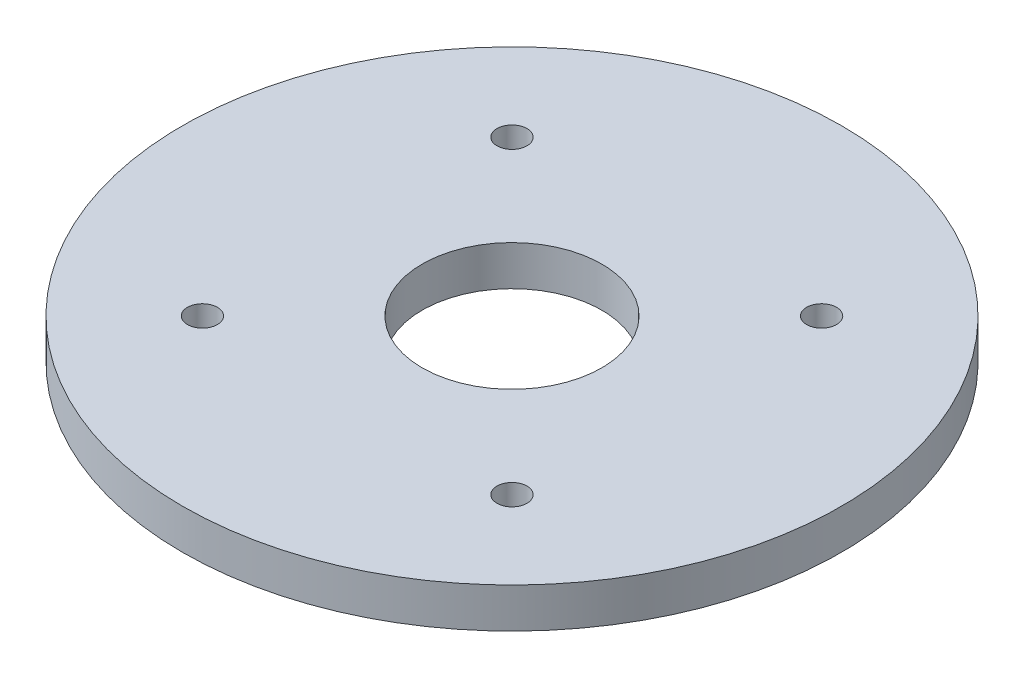
ISO-10303-21;
HEADER;
FILE_DESCRIPTION(('STEP AP214'),'2;1');
FILE_NAME('part.step','',(''),(''),'','','');
FILE_SCHEMA(('AUTOMOTIVE_DESIGN { 1 0 10303 214 1 1 1 1 }'));
ENDSEC;
DATA;
#1=APPLICATION_CONTEXT('core data for automotive mechanical design processes');
#2=APPLICATION_PROTOCOL_DEFINITION('international standard','automotive_design',2000,#1);
#3=PRODUCT_CONTEXT('',#1,'mechanical');
#4=PRODUCT('Part','Part','',(#3));
#5=PRODUCT_RELATED_PRODUCT_CATEGORY('part','',(#4));
#6=PRODUCT_DEFINITION_FORMATION('','',#4);
#7=PRODUCT_DEFINITION_CONTEXT('part definition',#1,'design');
#8=PRODUCT_DEFINITION('design','',#6,#7);
#9=PRODUCT_DEFINITION_SHAPE('','',#8);
#10=(LENGTH_UNIT() NAMED_UNIT(*) SI_UNIT(.MILLI.,.METRE.));
#11=(NAMED_UNIT(*) PLANE_ANGLE_UNIT() SI_UNIT($,.RADIAN.));
#12=(NAMED_UNIT(*) SI_UNIT($,.STERADIAN.) SOLID_ANGLE_UNIT());
#13=UNCERTAINTY_MEASURE_WITH_UNIT(LENGTH_MEASURE(1.E-05),#10,'distance_accuracy_value','');
#14=(GEOMETRIC_REPRESENTATION_CONTEXT(3) GLOBAL_UNCERTAINTY_ASSIGNED_CONTEXT((#13)) GLOBAL_UNIT_ASSIGNED_CONTEXT((#10,
#11,#12)) REPRESENTATION_CONTEXT('',''));
#15=CARTESIAN_POINT('',(0.,0.,0.));
#16=DIRECTION('',(0.,0.,1.));
#17=DIRECTION('',(1.,0.,0.));
#18=AXIS2_PLACEMENT_3D('',#15,#16,#17);
#19=CARTESIAN_POINT('',(0.,4.,0.));
#20=DIRECTION('',(0.,-1.,0.));
#21=DIRECTION('',(0.,0.,-1.));
#22=AXIS2_PLACEMENT_3D('',#19,#20,#21);
#23=CYLINDRICAL_SURFACE('',#22,33.);
#24=CARTESIAN_POINT('',(0.,4.,0.));
#25=DIRECTION('',(0.,1.,0.));
#26=DIRECTION('',(0.,0.,1.));
#27=AXIS2_PLACEMENT_3D('',#24,#25,#26);
#28=CIRCLE('',#27,33.);
#29=CARTESIAN_POINT('',(0.,4.,33.));
#30=VERTEX_POINT('',#29);
#31=EDGE_CURVE('E42',#30,#30,#28,.T.);
#32=ORIENTED_EDGE('',*,*,#31,.F.);
#33=EDGE_LOOP('',(#32));
#34=FACE_BOUND('',#33,.T.);
#35=CARTESIAN_POINT('',(0.,0.,0.));
#36=DIRECTION('',(0.,1.,0.));
#37=DIRECTION('',(0.,0.,1.));
#38=AXIS2_PLACEMENT_3D('',#35,#36,#37);
#39=CIRCLE('',#38,33.);
#40=CARTESIAN_POINT('',(0.,0.,33.));
#41=VERTEX_POINT('',#40);
#42=EDGE_CURVE('E62',#41,#41,#39,.T.);
#43=ORIENTED_EDGE('',*,*,#42,.T.);
#44=EDGE_LOOP('',(#43));
#45=FACE_BOUND('',#44,.T.);
#46=ADVANCED_FACE('F34',(#34,#45),#23,.T.);
#47=CARTESIAN_POINT('',(-15.5,4.,-15.5));
#48=DIRECTION('',(0.,-1.,0.));
#49=DIRECTION('',(0.,0.,-1.));
#50=AXIS2_PLACEMENT_3D('',#47,#48,#49);
#51=CYLINDRICAL_SURFACE('',#50,1.5);
#52=CARTESIAN_POINT('',(-15.5,4.,-15.5));
#53=DIRECTION('',(0.,1.,0.));
#54=DIRECTION('',(0.,0.,1.));
#55=AXIS2_PLACEMENT_3D('',#52,#53,#54);
#56=CIRCLE('',#55,1.5);
#57=CARTESIAN_POINT('',(-15.5,4.,-14.));
#58=VERTEX_POINT('',#57);
#59=EDGE_CURVE('E47',#58,#58,#56,.T.);
#60=ORIENTED_EDGE('',*,*,#59,.T.);
#61=EDGE_LOOP('',(#60));
#62=FACE_BOUND('',#61,.T.);
#63=CARTESIAN_POINT('',(-15.5,0.,-15.5));
#64=DIRECTION('',(0.,1.,0.));
#65=DIRECTION('',(0.,0.,1.));
#66=AXIS2_PLACEMENT_3D('',#63,#64,#65);
#67=CIRCLE('',#66,1.5);
#68=CARTESIAN_POINT('',(-15.5,0.,-14.));
#69=VERTEX_POINT('',#68);
#70=EDGE_CURVE('E60',#69,#69,#67,.T.);
#71=ORIENTED_EDGE('',*,*,#70,.F.);
#72=EDGE_LOOP('',(#71));
#73=FACE_BOUND('',#72,.T.);
#74=ADVANCED_FACE('F83',(#62,#73),#51,.F.);
#75=CARTESIAN_POINT('',(15.5,4.,-15.5));
#76=DIRECTION('',(0.,-1.,0.));
#77=DIRECTION('',(0.,0.,-1.));
#78=AXIS2_PLACEMENT_3D('',#75,#76,#77);
#79=CYLINDRICAL_SURFACE('',#78,1.5);
#80=CARTESIAN_POINT('',(15.5,4.,-15.5));
#81=DIRECTION('',(0.,1.,0.));
#82=DIRECTION('',(0.,0.,1.));
#83=AXIS2_PLACEMENT_3D('',#80,#81,#82);
#84=CIRCLE('',#83,1.5);
#85=CARTESIAN_POINT('',(15.5,4.,-14.));
#86=VERTEX_POINT('',#85);
#87=EDGE_CURVE('E76',#86,#86,#84,.T.);
#88=ORIENTED_EDGE('',*,*,#87,.T.);
#89=EDGE_LOOP('',(#88));
#90=FACE_BOUND('',#89,.T.);
#91=CARTESIAN_POINT('',(15.5,0.,-15.5));
#92=DIRECTION('',(0.,1.,0.));
#93=DIRECTION('',(0.,0.,1.));
#94=AXIS2_PLACEMENT_3D('',#91,#92,#93);
#95=CIRCLE('',#94,1.5);
#96=CARTESIAN_POINT('',(15.5,0.,-14.));
#97=VERTEX_POINT('',#96);
#98=EDGE_CURVE('E57',#97,#97,#95,.T.);
#99=ORIENTED_EDGE('',*,*,#98,.F.);
#100=EDGE_LOOP('',(#99));
#101=FACE_BOUND('',#100,.T.);
#102=ADVANCED_FACE('F101',(#90,#101),#79,.F.);
#103=CARTESIAN_POINT('',(-15.5,4.,15.5));
#104=DIRECTION('',(0.,-1.,0.));
#105=DIRECTION('',(0.,0.,-1.));
#106=AXIS2_PLACEMENT_3D('',#103,#104,#105);
#107=CYLINDRICAL_SURFACE('',#106,1.5);
#108=CARTESIAN_POINT('',(-15.5,4.,15.5));
#109=DIRECTION('',(0.,1.,0.));
#110=DIRECTION('',(0.,0.,1.));
#111=AXIS2_PLACEMENT_3D('',#108,#109,#110);
#112=CIRCLE('',#111,1.5);
#113=CARTESIAN_POINT('',(-15.5,4.,17.));
#114=VERTEX_POINT('',#113);
#115=EDGE_CURVE('E71',#114,#114,#112,.T.);
#116=ORIENTED_EDGE('',*,*,#115,.T.);
#117=EDGE_LOOP('',(#116));
#118=FACE_BOUND('',#117,.T.);
#119=CARTESIAN_POINT('',(-15.5,0.,15.5));
#120=DIRECTION('',(0.,1.,0.));
#121=DIRECTION('',(0.,0.,1.));
#122=AXIS2_PLACEMENT_3D('',#119,#120,#121);
#123=CIRCLE('',#122,1.5);
#124=CARTESIAN_POINT('',(-15.5,0.,17.));
#125=VERTEX_POINT('',#124);
#126=EDGE_CURVE('E54',#125,#125,#123,.T.);
#127=ORIENTED_EDGE('',*,*,#126,.F.);
#128=EDGE_LOOP('',(#127));
#129=FACE_BOUND('',#128,.T.);
#130=ADVANCED_FACE('F107',(#118,#129),#107,.F.);
#131=CARTESIAN_POINT('',(15.5,4.,15.5));
#132=DIRECTION('',(0.,-1.,0.));
#133=DIRECTION('',(0.,0.,-1.));
#134=AXIS2_PLACEMENT_3D('',#131,#132,#133);
#135=CYLINDRICAL_SURFACE('',#134,1.5);
#136=CARTESIAN_POINT('',(15.5,4.,15.5));
#137=DIRECTION('',(0.,1.,0.));
#138=DIRECTION('',(0.,0.,1.));
#139=AXIS2_PLACEMENT_3D('',#136,#137,#138);
#140=CIRCLE('',#139,1.5);
#141=CARTESIAN_POINT('',(15.5,4.,17.));
#142=VERTEX_POINT('',#141);
#143=EDGE_CURVE('E67',#142,#142,#140,.T.);
#144=ORIENTED_EDGE('',*,*,#143,.T.);
#145=EDGE_LOOP('',(#144));
#146=FACE_BOUND('',#145,.T.);
#147=CARTESIAN_POINT('',(15.5,0.,15.5));
#148=DIRECTION('',(0.,1.,0.));
#149=DIRECTION('',(0.,0.,1.));
#150=AXIS2_PLACEMENT_3D('',#147,#148,#149);
#151=CIRCLE('',#150,1.5);
#152=CARTESIAN_POINT('',(15.5,0.,17.));
#153=VERTEX_POINT('',#152);
#154=EDGE_CURVE('E51',#153,#153,#151,.T.);
#155=ORIENTED_EDGE('',*,*,#154,.F.);
#156=EDGE_LOOP('',(#155));
#157=FACE_BOUND('',#156,.T.);
#158=ADVANCED_FACE('F36',(#146,#157),#135,.F.);
#159=CARTESIAN_POINT('',(0.,4.,0.));
#160=DIRECTION('',(0.,-1.,0.));
#161=DIRECTION('',(0.,0.,-1.));
#162=AXIS2_PLACEMENT_3D('',#159,#160,#161);
#163=CYLINDRICAL_SURFACE('',#162,9.);
#164=CARTESIAN_POINT('',(0.,4.,0.));
#165=DIRECTION('',(0.,1.,0.));
#166=DIRECTION('',(0.,0.,1.));
#167=AXIS2_PLACEMENT_3D('',#164,#165,#166);
#168=CIRCLE('',#167,9.);
#169=CARTESIAN_POINT('',(0.,4.,9.));
#170=VERTEX_POINT('',#169);
#171=EDGE_CURVE('E10',#170,#170,#168,.T.);
#172=ORIENTED_EDGE('',*,*,#171,.T.);
#173=EDGE_LOOP('',(#172));
#174=FACE_BOUND('',#173,.T.);
#175=CARTESIAN_POINT('',(0.,0.,0.));
#176=DIRECTION('',(0.,1.,0.));
#177=DIRECTION('',(0.,0.,1.));
#178=AXIS2_PLACEMENT_3D('',#175,#176,#177);
#179=CIRCLE('',#178,9.);
#180=CARTESIAN_POINT('',(0.,0.,9.));
#181=VERTEX_POINT('',#180);
#182=EDGE_CURVE('E38',#181,#181,#179,.T.);
#183=ORIENTED_EDGE('',*,*,#182,.F.);
#184=EDGE_LOOP('',(#183));
#185=FACE_BOUND('',#184,.T.);
#186=ADVANCED_FACE('F90',(#174,#185),#163,.F.);
#187=CARTESIAN_POINT('',(0.,4.,0.));
#188=DIRECTION('',(0.,1.,0.));
#189=DIRECTION('',(0.,0.,1.));
#190=AXIS2_PLACEMENT_3D('',#187,#188,#189);
#191=PLANE('',#190);
#192=ORIENTED_EDGE('',*,*,#143,.F.);
#193=EDGE_LOOP('',(#192));
#194=FACE_BOUND('',#193,.T.);
#195=ORIENTED_EDGE('',*,*,#115,.F.);
#196=EDGE_LOOP('',(#195));
#197=FACE_BOUND('',#196,.T.);
#198=ORIENTED_EDGE('',*,*,#87,.F.);
#199=EDGE_LOOP('',(#198));
#200=FACE_BOUND('',#199,.T.);
#201=ORIENTED_EDGE('',*,*,#59,.F.);
#202=EDGE_LOOP('',(#201));
#203=FACE_BOUND('',#202,.T.);
#204=ORIENTED_EDGE('',*,*,#31,.T.);
#205=EDGE_LOOP('',(#204));
#206=FACE_BOUND('',#205,.T.);
#207=ORIENTED_EDGE('',*,*,#171,.F.);
#208=EDGE_LOOP('',(#207));
#209=FACE_BOUND('',#208,.T.);
#210=ADVANCED_FACE('F86',(#194,#197,#200,#203,#206,#209),#191,.T.);
#211=CARTESIAN_POINT('',(0.,0.,0.));
#212=DIRECTION('',(0.,1.,0.));
#213=DIRECTION('',(0.,0.,1.));
#214=AXIS2_PLACEMENT_3D('',#211,#212,#213);
#215=PLANE('',#214);
#216=ORIENTED_EDGE('',*,*,#154,.T.);
#217=EDGE_LOOP('',(#216));
#218=FACE_BOUND('',#217,.T.);
#219=ORIENTED_EDGE('',*,*,#126,.T.);
#220=EDGE_LOOP('',(#219));
#221=FACE_BOUND('',#220,.T.);
#222=ORIENTED_EDGE('',*,*,#98,.T.);
#223=EDGE_LOOP('',(#222));
#224=FACE_BOUND('',#223,.T.);
#225=ORIENTED_EDGE('',*,*,#70,.T.);
#226=EDGE_LOOP('',(#225));
#227=FACE_BOUND('',#226,.T.);
#228=ORIENTED_EDGE('',*,*,#42,.F.);
#229=EDGE_LOOP('',(#228));
#230=FACE_BOUND('',#229,.T.);
#231=ORIENTED_EDGE('',*,*,#182,.T.);
#232=EDGE_LOOP('',(#231));
#233=FACE_BOUND('',#232,.T.);
#234=ADVANCED_FACE('F89',(#218,#221,#224,#227,#230,#233),#215,.F.);
#235=CLOSED_SHELL('',(#46,#74,#102,#130,#158,#186,#210,#234));
#236=MANIFOLD_SOLID_BREP('B2',#235);
#237=ADVANCED_BREP_SHAPE_REPRESENTATION('',(#18,#236),#14);
#238=SHAPE_DEFINITION_REPRESENTATION(#9,#237);
ENDSEC;
END-ISO-10303-21;
